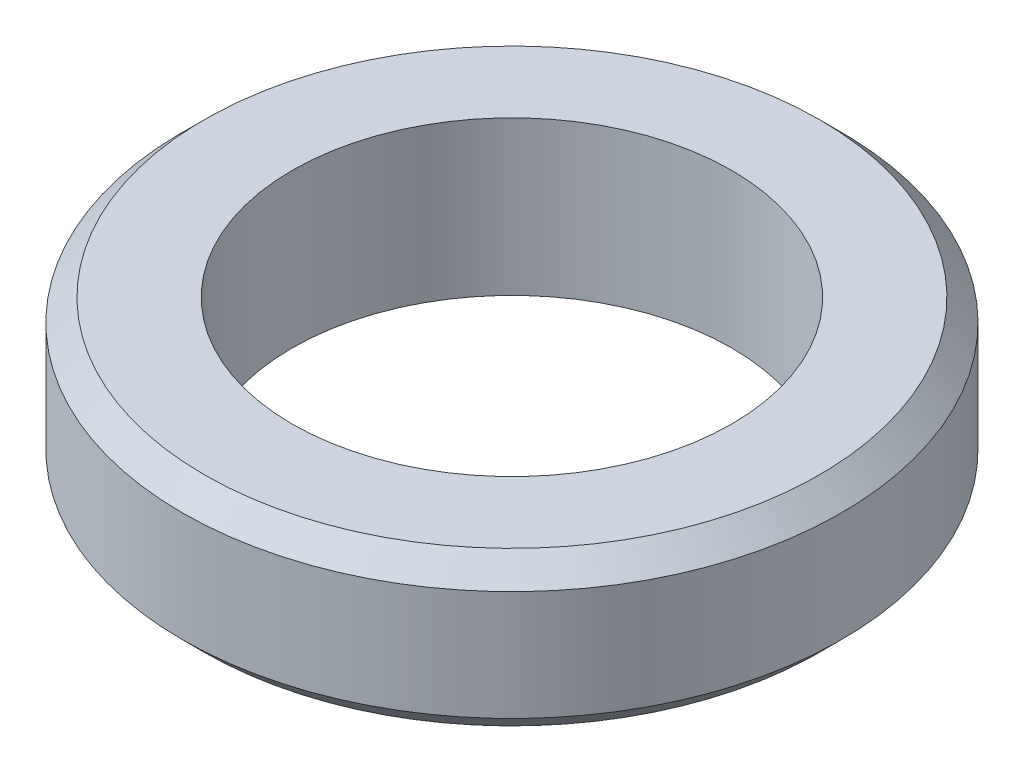
ISO-10303-21;
HEADER;
FILE_DESCRIPTION(('STEP AP214'),'2;1');
FILE_NAME('part.step','',(''),(''),'','','');
FILE_SCHEMA(('AUTOMOTIVE_DESIGN { 1 0 10303 214 1 1 1 1 }'));
ENDSEC;
DATA;
#1=APPLICATION_CONTEXT('core data for automotive mechanical design processes');
#2=APPLICATION_PROTOCOL_DEFINITION('international standard','automotive_design',2000,#1);
#3=PRODUCT_CONTEXT('',#1,'mechanical');
#4=PRODUCT('Part','Part','',(#3));
#5=PRODUCT_RELATED_PRODUCT_CATEGORY('part','',(#4));
#6=PRODUCT_DEFINITION_FORMATION('','',#4);
#7=PRODUCT_DEFINITION_CONTEXT('part definition',#1,'design');
#8=PRODUCT_DEFINITION('design','',#6,#7);
#9=PRODUCT_DEFINITION_SHAPE('','',#8);
#10=(LENGTH_UNIT() NAMED_UNIT(*) SI_UNIT(.MILLI.,.METRE.));
#11=(NAMED_UNIT(*) PLANE_ANGLE_UNIT() SI_UNIT($,.RADIAN.));
#12=(NAMED_UNIT(*) SI_UNIT($,.STERADIAN.) SOLID_ANGLE_UNIT());
#13=UNCERTAINTY_MEASURE_WITH_UNIT(LENGTH_MEASURE(1.E-05),#10,'distance_accuracy_value','');
#14=(GEOMETRIC_REPRESENTATION_CONTEXT(3) GLOBAL_UNCERTAINTY_ASSIGNED_CONTEXT((#13)) GLOBAL_UNIT_ASSIGNED_CONTEXT((#10,
#11,#12)) REPRESENTATION_CONTEXT('',''));
#15=CARTESIAN_POINT('',(0.,0.,0.));
#16=DIRECTION('',(0.,0.,1.));
#17=DIRECTION('',(1.,0.,0.));
#18=AXIS2_PLACEMENT_3D('',#15,#16,#17);
#19=CARTESIAN_POINT('',(0.,3.5,0.));
#20=DIRECTION('',(0.,1.,0.));
#21=DIRECTION('',(0.,0.,1.));
#22=AXIS2_PLACEMENT_3D('',#19,#20,#21);
#23=PLANE('',#22);
#24=CARTESIAN_POINT('',(0.,3.5,0.));
#25=DIRECTION('',(0.,1.,0.));
#26=DIRECTION('',(0.,0.,1.));
#27=AXIS2_PLACEMENT_3D('',#24,#25,#26);
#28=CIRCLE('',#27,7.);
#29=CARTESIAN_POINT('',(0.,3.5,7.));
#30=VERTEX_POINT('',#29);
#31=EDGE_CURVE('E10',#30,#30,#28,.T.);
#32=ORIENTED_EDGE('',*,*,#31,.T.);
#33=EDGE_LOOP('',(#32));
#34=FACE_BOUND('',#33,.T.);
#35=CARTESIAN_POINT('',(0.,3.5,0.));
#36=DIRECTION('',(0.,1.,0.));
#37=DIRECTION('',(0.,0.,1.));
#38=AXIS2_PLACEMENT_3D('',#35,#36,#37);
#39=CIRCLE('',#38,5.);
#40=CARTESIAN_POINT('',(0.,3.5,5.));
#41=VERTEX_POINT('',#40);
#42=EDGE_CURVE('E60',#41,#41,#39,.T.);
#43=ORIENTED_EDGE('',*,*,#42,.F.);
#44=EDGE_LOOP('',(#43));
#45=FACE_BOUND('',#44,.T.);
#46=ADVANCED_FACE('F39',(#34,#45),#23,.T.);
#47=CARTESIAN_POINT('',(0.,0.,0.));
#48=DIRECTION('',(0.,1.,0.));
#49=DIRECTION('',(0.,0.,1.));
#50=AXIS2_PLACEMENT_3D('',#47,#48,#49);
#51=PLANE('',#50);
#52=CARTESIAN_POINT('',(0.,0.,0.));
#53=DIRECTION('',(0.,1.,0.));
#54=DIRECTION('',(0.,0.,1.));
#55=AXIS2_PLACEMENT_3D('',#52,#53,#54);
#56=CIRCLE('',#55,7.);
#57=CARTESIAN_POINT('',(0.,0.,7.));
#58=VERTEX_POINT('',#57);
#59=EDGE_CURVE('E47',#58,#58,#56,.F.);
#60=ORIENTED_EDGE('',*,*,#59,.T.);
#61=EDGE_LOOP('',(#60));
#62=FACE_BOUND('',#61,.T.);
#63=CARTESIAN_POINT('',(0.,0.,0.));
#64=DIRECTION('',(0.,1.,0.));
#65=DIRECTION('',(0.,0.,1.));
#66=AXIS2_PLACEMENT_3D('',#63,#64,#65);
#67=CIRCLE('',#66,5.);
#68=CARTESIAN_POINT('',(0.,0.,5.));
#69=VERTEX_POINT('',#68);
#70=EDGE_CURVE('E61',#69,#69,#67,.T.);
#71=ORIENTED_EDGE('',*,*,#70,.T.);
#72=EDGE_LOOP('',(#71));
#73=FACE_BOUND('',#72,.T.);
#74=ADVANCED_FACE('F71',(#62,#73),#51,.F.);
#75=CARTESIAN_POINT('',(0.,3.5,0.));
#76=DIRECTION('',(0.,-1.,0.));
#77=DIRECTION('',(0.,0.,-1.));
#78=AXIS2_PLACEMENT_3D('',#75,#76,#77);
#79=CYLINDRICAL_SURFACE('',#78,7.5);
#80=CARTESIAN_POINT('',(0.,0.500000000000003,0.));
#81=DIRECTION('',(0.,1.,0.));
#82=DIRECTION('',(0.,0.,1.));
#83=AXIS2_PLACEMENT_3D('',#80,#81,#82);
#84=CIRCLE('',#83,7.5);
#85=CARTESIAN_POINT('',(0.,0.500000000000003,7.5));
#86=VERTEX_POINT('',#85);
#87=EDGE_CURVE('E51',#86,#86,#84,.T.);
#88=ORIENTED_EDGE('',*,*,#87,.T.);
#89=EDGE_LOOP('',(#88));
#90=FACE_BOUND('',#89,.T.);
#91=CARTESIAN_POINT('',(0.,3.,0.));
#92=DIRECTION('',(0.,1.,0.));
#93=DIRECTION('',(0.,0.,1.));
#94=AXIS2_PLACEMENT_3D('',#91,#92,#93);
#95=CIRCLE('',#94,7.5);
#96=CARTESIAN_POINT('',(0.,3.,7.5));
#97=VERTEX_POINT('',#96);
#98=EDGE_CURVE('E55',#97,#97,#95,.F.);
#99=ORIENTED_EDGE('',*,*,#98,.T.);
#100=EDGE_LOOP('',(#99));
#101=FACE_BOUND('',#100,.T.);
#102=ADVANCED_FACE('F76',(#90,#101),#79,.T.);
#103=CARTESIAN_POINT('',(0.,3.5,0.));
#104=DIRECTION('',(0.,-1.,0.));
#105=DIRECTION('',(0.,0.,-1.));
#106=AXIS2_PLACEMENT_3D('',#103,#104,#105);
#107=CYLINDRICAL_SURFACE('',#106,5.);
#108=ORIENTED_EDGE('',*,*,#42,.T.);
#109=EDGE_LOOP('',(#108));
#110=FACE_BOUND('',#109,.T.);
#111=ORIENTED_EDGE('',*,*,#70,.F.);
#112=EDGE_LOOP('',(#111));
#113=FACE_BOUND('',#112,.T.);
#114=ADVANCED_FACE('F67',(#110,#113),#107,.F.);
#115=CARTESIAN_POINT('',(0.,0.500000000000003,0.));
#116=DIRECTION('',(0.,1.,0.));
#117=DIRECTION('',(0.,0.,1.));
#118=AXIS2_PLACEMENT_3D('',#115,#116,#117);
#119=CONICAL_SURFACE('',#118,7.5,0.785398163397448);
#120=ORIENTED_EDGE('',*,*,#59,.F.);
#121=EDGE_LOOP('',(#120));
#122=FACE_BOUND('',#121,.T.);
#123=ORIENTED_EDGE('',*,*,#87,.F.);
#124=EDGE_LOOP('',(#123));
#125=FACE_BOUND('',#124,.T.);
#126=ADVANCED_FACE('F83',(#122,#125),#119,.T.);
#127=CARTESIAN_POINT('',(0.,3.5,0.));
#128=DIRECTION('',(0.,-1.,0.));
#129=DIRECTION('',(0.,0.,-1.));
#130=AXIS2_PLACEMENT_3D('',#127,#128,#129);
#131=CONICAL_SURFACE('',#130,7.,0.785398163397447);
#132=ORIENTED_EDGE('',*,*,#98,.F.);
#133=EDGE_LOOP('',(#132));
#134=FACE_BOUND('',#133,.T.);
#135=ORIENTED_EDGE('',*,*,#31,.F.);
#136=EDGE_LOOP('',(#135));
#137=FACE_BOUND('',#136,.T.);
#138=ADVANCED_FACE('F42',(#134,#137),#131,.T.);
#139=CLOSED_SHELL('',(#46,#74,#102,#114,#126,#138));
#140=MANIFOLD_SOLID_BREP('B2',#139);
#141=ADVANCED_BREP_SHAPE_REPRESENTATION('',(#18,#140),#14);
#142=SHAPE_DEFINITION_REPRESENTATION(#9,#141);
ENDSEC;
END-ISO-10303-21;
